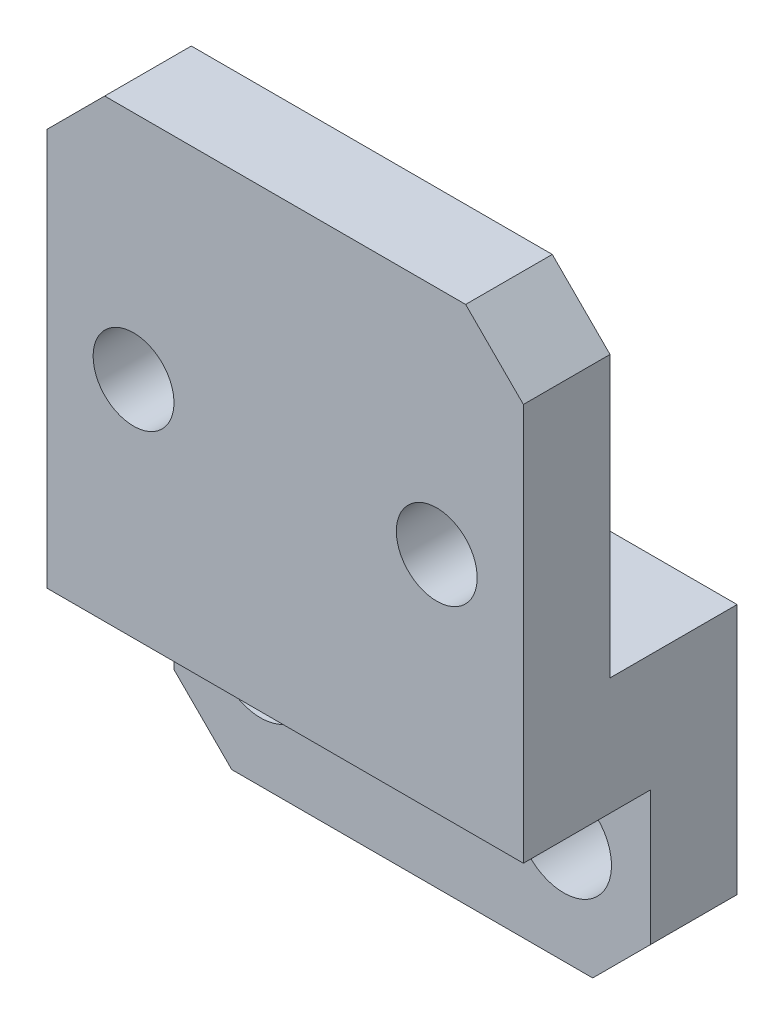
ISO-10303-21;
HEADER;
FILE_DESCRIPTION(('STEP AP214'),'2;1');
FILE_NAME('part.step','',(''),(''),'','','');
FILE_SCHEMA(('AUTOMOTIVE_DESIGN { 1 0 10303 214 1 1 1 1 }'));
ENDSEC;
DATA;
#1=APPLICATION_CONTEXT('core data for automotive mechanical design processes');
#2=APPLICATION_PROTOCOL_DEFINITION('international standard','automotive_design',2000,#1);
#3=PRODUCT_CONTEXT('',#1,'mechanical');
#4=PRODUCT('Part','Part','',(#3));
#5=PRODUCT_RELATED_PRODUCT_CATEGORY('part','',(#4));
#6=PRODUCT_DEFINITION_FORMATION('','',#4);
#7=PRODUCT_DEFINITION_CONTEXT('part definition',#1,'design');
#8=PRODUCT_DEFINITION('design','',#6,#7);
#9=PRODUCT_DEFINITION_SHAPE('','',#8);
#10=(LENGTH_UNIT() NAMED_UNIT(*) SI_UNIT(.MILLI.,.METRE.));
#11=(NAMED_UNIT(*) PLANE_ANGLE_UNIT() SI_UNIT($,.RADIAN.));
#12=(NAMED_UNIT(*) SI_UNIT($,.STERADIAN.) SOLID_ANGLE_UNIT());
#13=UNCERTAINTY_MEASURE_WITH_UNIT(LENGTH_MEASURE(1.E-05),#10,'distance_accuracy_value','');
#14=(GEOMETRIC_REPRESENTATION_CONTEXT(3) GLOBAL_UNCERTAINTY_ASSIGNED_CONTEXT((#13)) GLOBAL_UNIT_ASSIGNED_CONTEXT((#10,
#11,#12)) REPRESENTATION_CONTEXT('',''));
#15=CARTESIAN_POINT('',(0.,0.,0.));
#16=DIRECTION('',(0.,0.,1.));
#17=DIRECTION('',(1.,0.,0.));
#18=AXIS2_PLACEMENT_3D('',#15,#16,#17);
#19=CARTESIAN_POINT('',(0.,0.,-4.40000000000001));
#20=DIRECTION('',(0.,0.,-1.));
#21=DIRECTION('',(-1.,0.,0.));
#22=AXIS2_PLACEMENT_3D('',#19,#20,#21);
#23=PLANE('',#22);
#24=DIRECTION('',(0.,1.,0.));
#25=VECTOR('',#24,1.);
#26=CARTESIAN_POINT('',(-1.72988438920063,-17.1999999999999,-4.40000000000001));
#27=LINE('',#26,#25);
#28=CARTESIAN_POINT('',(-1.72988438920063,-10.900000000024,-4.40000000000001));
#29=VERTEX_POINT('',#28);
#30=CARTESIAN_POINT('',(-1.72988438920063,-0.199999999999945,-4.40000000000001));
#31=VERTEX_POINT('',#30);
#32=EDGE_CURVE('E151',#29,#31,#27,.T.);
#33=ORIENTED_EDGE('',*,*,#32,.F.);
#34=DIRECTION('',(-1.,0.,0.));
#35=VECTOR('',#34,1.);
#36=CARTESIAN_POINT('',(8.24999999999998,-10.900000000024,-4.40000000000001));
#37=LINE('',#36,#35);
#38=CARTESIAN_POINT('',(-6.25000000000001,-10.900000000024,-4.40000000000001));
#39=VERTEX_POINT('',#38);
#40=EDGE_CURVE('E75',#29,#39,#37,.T.);
#41=ORIENTED_EDGE('',*,*,#40,.T.);
#42=DIRECTION('',(0.707106781186549,-0.707106781186546,0.));
#43=VECTOR('',#42,1.);
#44=CARTESIAN_POINT('',(-8.57500000001198,-8.57500000001201,-4.40000000000001));
#45=LINE('',#44,#43);
#46=CARTESIAN_POINT('',(-8.25000000000002,-8.90000000002397,-4.40000000000001));
#47=VERTEX_POINT('',#46);
#48=EDGE_CURVE('E61',#39,#47,#45,.F.);
#49=ORIENTED_EDGE('',*,*,#48,.T.);
#50=DIRECTION('',(0.,1.,0.));
#51=VECTOR('',#50,1.);
#52=CARTESIAN_POINT('',(-8.25000000000002,-0.199999999999944,-4.40000000000001));
#53=LINE('',#52,#51);
#54=CARTESIAN_POINT('',(-8.25000000000002,-0.199999999999944,-4.40000000000001));
#55=VERTEX_POINT('',#54);
#56=EDGE_CURVE('E171',#47,#55,#53,.T.);
#57=ORIENTED_EDGE('',*,*,#56,.T.);
#58=DIRECTION('',(1.,0.,0.));
#59=VECTOR('',#58,1.);
#60=CARTESIAN_POINT('',(8.24999999999998,-0.199999999999944,-4.40000000000001));
#61=LINE('',#60,#59);
#62=EDGE_CURVE('E164',#55,#31,#61,.T.);
#63=ORIENTED_EDGE('',*,*,#62,.T.);
#64=EDGE_LOOP('',(#33,#41,#49,#57,#63));
#65=FACE_BOUND('',#64,.T.);
#66=CARTESIAN_POINT('',(-5.25000000000002,-7.20000000002397,-4.40000000000001));
#67=DIRECTION('',(0.,0.,-1.));
#68=DIRECTION('',(-1.,0.,0.));
#69=AXIS2_PLACEMENT_3D('',#66,#67,#68);
#70=CIRCLE('',#69,1.65);
#71=CARTESIAN_POINT('',(-6.90000000000002,-7.20000000002397,-4.40000000000001));
#72=VERTEX_POINT('',#71);
#73=EDGE_CURVE('E377',#72,#72,#70,.T.);
#74=ORIENTED_EDGE('',*,*,#73,.F.);
#75=EDGE_LOOP('',(#74));
#76=FACE_BOUND('',#75,.T.);
#77=ADVANCED_FACE('F51',(#65,#76),#23,.T.);
#78=CARTESIAN_POINT('',(8.24999999999998,11.5000000000001,3.));
#79=DIRECTION('',(-1.,0.,0.));
#80=DIRECTION('',(0.,0.,1.));
#81=AXIS2_PLACEMENT_3D('',#78,#79,#80);
#82=PLANE('',#81);
#83=DIRECTION('',(0.,1.,0.));
#84=VECTOR('',#83,1.);
#85=CARTESIAN_POINT('',(8.24999999999998,11.5000000000001,0.));
#86=LINE('',#85,#84);
#87=CARTESIAN_POINT('',(8.24999999999998,-0.199999999999944,0.));
#88=VERTEX_POINT('',#87);
#89=CARTESIAN_POINT('',(8.24999999999998,9.50000000000005,0.));
#90=VERTEX_POINT('',#89);
#91=EDGE_CURVE('E203',#88,#90,#86,.T.);
#92=ORIENTED_EDGE('',*,*,#91,.T.);
#93=DIRECTION('',(0.,0.,1.));
#94=VECTOR('',#93,1.);
#95=CARTESIAN_POINT('',(8.24999999999998,9.50000000000005,3.));
#96=LINE('',#95,#94);
#97=CARTESIAN_POINT('',(8.24999999999998,9.50000000000005,3.));
#98=VERTEX_POINT('',#97);
#99=EDGE_CURVE('E272',#90,#98,#96,.T.);
#100=ORIENTED_EDGE('',*,*,#99,.T.);
#101=DIRECTION('',(0.,1.,0.));
#102=VECTOR('',#101,1.);
#103=CARTESIAN_POINT('',(8.24999999999998,11.5000000000001,3.));
#104=LINE('',#103,#102);
#105=CARTESIAN_POINT('',(8.24999999999998,-4.25858882568875,3.));
#106=VERTEX_POINT('',#105);
#107=EDGE_CURVE('E211',#106,#98,#104,.T.);
#108=ORIENTED_EDGE('',*,*,#107,.F.);
#109=DIRECTION('',(0.,0.,-1.));
#110=VECTOR('',#109,1.);
#111=CARTESIAN_POINT('',(8.24999999999998,-4.25858882568875,3.));
#112=LINE('',#111,#110);
#113=CARTESIAN_POINT('',(8.24999999999998,-4.25858882568875,-1.40000000000001));
#114=VERTEX_POINT('',#113);
#115=EDGE_CURVE('E226',#106,#114,#112,.T.);
#116=ORIENTED_EDGE('',*,*,#115,.T.);
#117=DIRECTION('',(0.,-1.,0.));
#118=VECTOR('',#117,1.);
#119=CARTESIAN_POINT('',(8.24999999999998,-0.199999999999944,-1.40000000000001));
#120=LINE('',#119,#118);
#121=CARTESIAN_POINT('',(8.24999999999998,-8.90000000002397,-1.40000000000001));
#122=VERTEX_POINT('',#121);
#123=EDGE_CURVE('E187',#114,#122,#120,.T.);
#124=ORIENTED_EDGE('',*,*,#123,.T.);
#125=DIRECTION('',(0.,0.,-1.));
#126=VECTOR('',#125,1.);
#127=CARTESIAN_POINT('',(8.24999999999998,-8.90000000002397,3.));
#128=LINE('',#127,#126);
#129=CARTESIAN_POINT('',(8.24999999999998,-8.90000000002397,-4.40000000000001));
#130=VERTEX_POINT('',#129);
#131=EDGE_CURVE('E269',#122,#130,#128,.T.);
#132=ORIENTED_EDGE('',*,*,#131,.T.);
#133=DIRECTION('',(0.,-1.,0.));
#134=VECTOR('',#133,1.);
#135=CARTESIAN_POINT('',(8.24999999999998,-0.199999999999944,-4.40000000000001));
#136=LINE('',#135,#134);
#137=CARTESIAN_POINT('',(8.24999999999998,-0.199999999999944,-4.40000000000001));
#138=VERTEX_POINT('',#137);
#139=EDGE_CURVE('E199',#138,#130,#136,.T.);
#140=ORIENTED_EDGE('',*,*,#139,.F.);
#141=DIRECTION('',(0.,0.,1.));
#142=VECTOR('',#141,1.);
#143=CARTESIAN_POINT('',(8.24999999999998,-0.199999999999944,-18.391825777591));
#144=LINE('',#143,#142);
#145=EDGE_CURVE('E181',#138,#88,#144,.T.);
#146=ORIENTED_EDGE('',*,*,#145,.T.);
#147=EDGE_LOOP('',(#92,#100,#108,#116,#124,#132,#140,#146));
#148=FACE_BOUND('',#147,.T.);
#149=ADVANCED_FACE('F317',(#148),#82,.F.);
#150=CARTESIAN_POINT('',(8.24999999999998,11.5000000000001,3.));
#151=DIRECTION('',(0.,-1.,0.));
#152=DIRECTION('',(0.,0.,-1.));
#153=AXIS2_PLACEMENT_3D('',#150,#151,#152);
#154=PLANE('',#153);
#155=DIRECTION('',(-1.,0.,0.));
#156=VECTOR('',#155,1.);
#157=CARTESIAN_POINT('',(8.24999999999998,11.5000000000001,0.));
#158=LINE('',#157,#156);
#159=CARTESIAN_POINT('',(6.24999999999998,11.5000000000001,0.));
#160=VERTEX_POINT('',#159);
#161=CARTESIAN_POINT('',(-6.25000000000001,11.5000000000001,0.));
#162=VERTEX_POINT('',#161);
#163=EDGE_CURVE('E230',#160,#162,#158,.T.);
#164=ORIENTED_EDGE('',*,*,#163,.T.);
#165=DIRECTION('',(0.,0.,1.));
#166=VECTOR('',#165,1.);
#167=CARTESIAN_POINT('',(-6.25000000000001,11.5000000000001,3.));
#168=LINE('',#167,#166);
#169=CARTESIAN_POINT('',(-6.25000000000001,11.5000000000001,3.));
#170=VERTEX_POINT('',#169);
#171=EDGE_CURVE('E260',#162,#170,#168,.T.);
#172=ORIENTED_EDGE('',*,*,#171,.T.);
#173=DIRECTION('',(-1.,0.,0.));
#174=VECTOR('',#173,1.);
#175=CARTESIAN_POINT('',(8.24999999999998,11.5000000000001,3.));
#176=LINE('',#175,#174);
#177=CARTESIAN_POINT('',(6.24999999999998,11.5000000000001,3.));
#178=VERTEX_POINT('',#177);
#179=EDGE_CURVE('E215',#178,#170,#176,.T.);
#180=ORIENTED_EDGE('',*,*,#179,.F.);
#181=DIRECTION('',(0.,0.,-1.));
#182=VECTOR('',#181,1.);
#183=CARTESIAN_POINT('',(6.24999999999998,11.5000000000001,3.));
#184=LINE('',#183,#182);
#185=EDGE_CURVE('E256',#178,#160,#184,.T.);
#186=ORIENTED_EDGE('',*,*,#185,.T.);
#187=EDGE_LOOP('',(#164,#172,#180,#186));
#188=FACE_BOUND('',#187,.T.);
#189=ADVANCED_FACE('F338',(#188),#154,.F.);
#190=CARTESIAN_POINT('',(-8.25000000000002,11.5000000000001,3.));
#191=DIRECTION('',(1.,0.,0.));
#192=DIRECTION('',(0.,0.,-1.));
#193=AXIS2_PLACEMENT_3D('',#190,#191,#192);
#194=PLANE('',#193);
#195=DIRECTION('',(0.,-1.,0.));
#196=VECTOR('',#195,1.);
#197=CARTESIAN_POINT('',(-8.25000000000002,11.5000000000001,3.));
#198=LINE('',#197,#196);
#199=CARTESIAN_POINT('',(-8.25000000000002,9.50000000000006,3.));
#200=VERTEX_POINT('',#199);
#201=CARTESIAN_POINT('',(-8.25000000000002,-4.25858882568875,3.));
#202=VERTEX_POINT('',#201);
#203=EDGE_CURVE('E220',#200,#202,#198,.T.);
#204=ORIENTED_EDGE('',*,*,#203,.F.);
#205=DIRECTION('',(0.,0.,-1.));
#206=VECTOR('',#205,1.);
#207=CARTESIAN_POINT('',(-8.25000000000002,9.50000000000006,3.));
#208=LINE('',#207,#206);
#209=CARTESIAN_POINT('',(-8.25000000000002,9.50000000000006,0.));
#210=VERTEX_POINT('',#209);
#211=EDGE_CURVE('E246',#200,#210,#208,.T.);
#212=ORIENTED_EDGE('',*,*,#211,.T.);
#213=DIRECTION('',(0.,-1.,0.));
#214=VECTOR('',#213,1.);
#215=CARTESIAN_POINT('',(-8.25000000000002,11.5000000000001,0.));
#216=LINE('',#215,#214);
#217=CARTESIAN_POINT('',(-8.25000000000002,-0.199999999999945,0.));
#218=VERTEX_POINT('',#217);
#219=EDGE_CURVE('E216',#210,#218,#216,.T.);
#220=ORIENTED_EDGE('',*,*,#219,.T.);
#221=DIRECTION('',(0.,0.,1.));
#222=VECTOR('',#221,1.);
#223=CARTESIAN_POINT('',(-8.25000000000002,-0.199999999999945,-18.391825777591));
#224=LINE('',#223,#222);
#225=EDGE_CURVE('E204',#55,#218,#224,.T.);
#226=ORIENTED_EDGE('',*,*,#225,.F.);
#227=ORIENTED_EDGE('',*,*,#56,.F.);
#228=DIRECTION('',(0.,0.,1.));
#229=VECTOR('',#228,1.);
#230=CARTESIAN_POINT('',(-8.25000000000002,-8.90000000002397,3.));
#231=LINE('',#230,#229);
#232=CARTESIAN_POINT('',(-8.25000000000002,-8.90000000002397,-1.40000000000001));
#233=VERTEX_POINT('',#232);
#234=EDGE_CURVE('E242',#47,#233,#231,.T.);
#235=ORIENTED_EDGE('',*,*,#234,.T.);
#236=DIRECTION('',(0.,1.,0.));
#237=VECTOR('',#236,1.);
#238=CARTESIAN_POINT('',(-8.25000000000002,-0.199999999999944,-1.40000000000001));
#239=LINE('',#238,#237);
#240=CARTESIAN_POINT('',(-8.25000000000002,-4.25858882568875,-1.40000000000001));
#241=VERTEX_POINT('',#240);
#242=EDGE_CURVE('E196',#233,#241,#239,.T.);
#243=ORIENTED_EDGE('',*,*,#242,.T.);
#244=DIRECTION('',(0.,0.,-1.));
#245=VECTOR('',#244,1.);
#246=CARTESIAN_POINT('',(-8.25000000000002,-4.25858882568875,3.));
#247=LINE('',#246,#245);
#248=EDGE_CURVE('E238',#202,#241,#247,.T.);
#249=ORIENTED_EDGE('',*,*,#248,.F.);
#250=EDGE_LOOP('',(#204,#212,#220,#226,#227,#235,#243,#249));
#251=FACE_BOUND('',#250,.T.);
#252=ADVANCED_FACE('F298',(#251),#194,.F.);
#253=CARTESIAN_POINT('',(8.24999999999998,-4.25858882568875,3.));
#254=DIRECTION('',(0.,1.,0.));
#255=DIRECTION('',(-1.,0.,0.));
#256=AXIS2_PLACEMENT_3D('',#253,#254,#255);
#257=PLANE('',#256);
#258=ORIENTED_EDGE('',*,*,#248,.T.);
#259=DIRECTION('',(1.,0.,0.));
#260=VECTOR('',#259,1.);
#261=CARTESIAN_POINT('',(8.24999999999998,-4.25858882568875,-1.40000000000001));
#262=LINE('',#261,#260);
#263=EDGE_CURVE('E200',#241,#114,#262,.T.);
#264=ORIENTED_EDGE('',*,*,#263,.T.);
#265=ORIENTED_EDGE('',*,*,#115,.F.);
#266=DIRECTION('',(1.,0.,0.));
#267=VECTOR('',#266,1.);
#268=CARTESIAN_POINT('',(8.24999999999998,-4.25858882568875,3.));
#269=LINE('',#268,#267);
#270=EDGE_CURVE('E223',#202,#106,#269,.T.);
#271=ORIENTED_EDGE('',*,*,#270,.F.);
#272=EDGE_LOOP('',(#258,#264,#265,#271));
#273=FACE_BOUND('',#272,.T.);
#274=ADVANCED_FACE('F324',(#273),#257,.F.);
#275=CARTESIAN_POINT('',(0.,0.,3.));
#276=DIRECTION('',(0.,0.,-1.));
#277=DIRECTION('',(-1.,0.,0.));
#278=AXIS2_PLACEMENT_3D('',#275,#276,#277);
#279=PLANE('',#278);
#280=CARTESIAN_POINT('',(5.24999999999997,3.50000000000006,3.));
#281=DIRECTION('',(0.,0.,-1.));
#282=DIRECTION('',(-1.,0.,0.));
#283=AXIS2_PLACEMENT_3D('',#280,#281,#282);
#284=CIRCLE('',#283,1.4);
#285=CARTESIAN_POINT('',(3.84999999999997,3.50000000000006,3.));
#286=VERTEX_POINT('',#285);
#287=EDGE_CURVE('E363',#286,#286,#284,.T.);
#288=ORIENTED_EDGE('',*,*,#287,.T.);
#289=EDGE_LOOP('',(#288));
#290=FACE_BOUND('',#289,.T.);
#291=CARTESIAN_POINT('',(-5.25000000000003,3.50000000000006,3.));
#292=DIRECTION('',(0.,0.,-1.));
#293=DIRECTION('',(-1.,0.,0.));
#294=AXIS2_PLACEMENT_3D('',#291,#292,#293);
#295=CIRCLE('',#294,1.4);
#296=CARTESIAN_POINT('',(-6.65000000000003,3.50000000000006,3.));
#297=VERTEX_POINT('',#296);
#298=EDGE_CURVE('E157',#297,#297,#295,.T.);
#299=ORIENTED_EDGE('',*,*,#298,.T.);
#300=EDGE_LOOP('',(#299));
#301=FACE_BOUND('',#300,.T.);
#302=ORIENTED_EDGE('',*,*,#179,.T.);
#303=DIRECTION('',(0.707106781186549,0.707106781186546,0.));
#304=VECTOR('',#303,1.);
#305=CARTESIAN_POINT('',(-8.25000000000002,9.50000000000006,3.));
#306=LINE('',#305,#304);
#307=EDGE_CURVE('E266',#170,#200,#306,.F.);
#308=ORIENTED_EDGE('',*,*,#307,.T.);
#309=ORIENTED_EDGE('',*,*,#203,.T.);
#310=ORIENTED_EDGE('',*,*,#270,.T.);
#311=ORIENTED_EDGE('',*,*,#107,.T.);
#312=DIRECTION('',(0.707106781186546,-0.707106781186549,0.));
#313=VECTOR('',#312,1.);
#314=CARTESIAN_POINT('',(6.24999999999998,11.5000000000001,3.));
#315=LINE('',#314,#313);
#316=EDGE_CURVE('E263',#98,#178,#315,.F.);
#317=ORIENTED_EDGE('',*,*,#316,.T.);
#318=EDGE_LOOP('',(#302,#308,#309,#310,#311,#317));
#319=FACE_BOUND('',#318,.T.);
#320=ADVANCED_FACE('F417',(#290,#301,#319),#279,.F.);
#321=CARTESIAN_POINT('',(0.,0.,0.));
#322=DIRECTION('',(0.,0.,-1.));
#323=DIRECTION('',(-1.,0.,0.));
#324=AXIS2_PLACEMENT_3D('',#321,#322,#323);
#325=PLANE('',#324);
#326=CARTESIAN_POINT('',(5.24999999999997,3.50000000000006,0.));
#327=DIRECTION('',(0.,0.,-1.));
#328=DIRECTION('',(-1.,0.,0.));
#329=AXIS2_PLACEMENT_3D('',#326,#327,#328);
#330=CIRCLE('',#329,1.4);
#331=CARTESIAN_POINT('',(3.84999999999997,3.50000000000006,0.));
#332=VERTEX_POINT('',#331);
#333=EDGE_CURVE('E368',#332,#332,#330,.T.);
#334=ORIENTED_EDGE('',*,*,#333,.F.);
#335=EDGE_LOOP('',(#334));
#336=FACE_BOUND('',#335,.T.);
#337=CARTESIAN_POINT('',(-5.25000000000003,3.50000000000006,0.));
#338=DIRECTION('',(0.,0.,-1.));
#339=DIRECTION('',(-1.,0.,0.));
#340=AXIS2_PLACEMENT_3D('',#337,#338,#339);
#341=CIRCLE('',#340,1.4);
#342=CARTESIAN_POINT('',(-6.65000000000003,3.50000000000006,0.));
#343=VERTEX_POINT('',#342);
#344=EDGE_CURVE('E372',#343,#343,#341,.T.);
#345=ORIENTED_EDGE('',*,*,#344,.F.);
#346=EDGE_LOOP('',(#345));
#347=FACE_BOUND('',#346,.T.);
#348=ORIENTED_EDGE('',*,*,#219,.F.);
#349=DIRECTION('',(-0.707106781186549,-0.707106781186546,0.));
#350=VECTOR('',#349,1.);
#351=CARTESIAN_POINT('',(-8.87500000000002,8.87500000000006,0.));
#352=LINE('',#351,#350);
#353=EDGE_CURVE('E253',#210,#162,#352,.F.);
#354=ORIENTED_EDGE('',*,*,#353,.T.);
#355=ORIENTED_EDGE('',*,*,#163,.F.);
#356=DIRECTION('',(-0.707106781186546,0.707106781186549,0.));
#357=VECTOR('',#356,1.);
#358=CARTESIAN_POINT('',(8.87500000000003,8.875,0.));
#359=LINE('',#358,#357);
#360=EDGE_CURVE('E250',#160,#90,#359,.F.);
#361=ORIENTED_EDGE('',*,*,#360,.T.);
#362=ORIENTED_EDGE('',*,*,#91,.F.);
#363=DIRECTION('',(1.,0.,0.));
#364=VECTOR('',#363,1.);
#365=CARTESIAN_POINT('',(8.24999999999998,-0.199999999999944,0.));
#366=LINE('',#365,#364);
#367=EDGE_CURVE('E174',#218,#88,#366,.T.);
#368=ORIENTED_EDGE('',*,*,#367,.F.);
#369=EDGE_LOOP('',(#348,#354,#355,#361,#362,#368));
#370=FACE_BOUND('',#369,.T.);
#371=ADVANCED_FACE('F335',(#336,#347,#370),#325,.T.);
#372=CARTESIAN_POINT('',(8.24999999999998,-0.199999999999944,-18.391825777591));
#373=DIRECTION('',(0.,-1.,0.));
#374=DIRECTION('',(1.,0.,0.));
#375=AXIS2_PLACEMENT_3D('',#372,#373,#374);
#376=PLANE('',#375);
#377=CARTESIAN_POINT('',(1.72988438920059,-0.199999999999944,-4.40000000000001));
#378=VERTEX_POINT('',#377);
#379=EDGE_CURVE('E166',#378,#138,#61,.T.);
#380=ORIENTED_EDGE('',*,*,#379,.F.);
#381=CARTESIAN_POINT('',(0.,-0.199999999999945,-8.50000000000001));
#382=DIRECTION('',(0.,1.,0.));
#383=DIRECTION('',(-1.,0.,0.));
#384=AXIS2_PLACEMENT_3D('',#381,#382,#383);
#385=CIRCLE('',#384,4.45);
#386=EDGE_CURVE('E154',#31,#378,#385,.T.);
#387=ORIENTED_EDGE('',*,*,#386,.F.);
#388=ORIENTED_EDGE('',*,*,#62,.F.);
#389=ORIENTED_EDGE('',*,*,#225,.T.);
#390=ORIENTED_EDGE('',*,*,#367,.T.);
#391=ORIENTED_EDGE('',*,*,#145,.F.);
#392=EDGE_LOOP('',(#380,#387,#388,#389,#390,#391));
#393=FACE_BOUND('',#392,.T.);
#394=ADVANCED_FACE('F162',(#393),#376,.F.);
#395=DIRECTION('',(0.,1.,0.));
#396=VECTOR('',#395,1.);
#397=CARTESIAN_POINT('',(1.72988438920059,-17.1999999999999,-4.40000000000001));
#398=LINE('',#397,#396);
#399=CARTESIAN_POINT('',(1.72988438920059,-10.900000000024,-4.40000000000001));
#400=VERTEX_POINT('',#399);
#401=EDGE_CURVE('E68',#378,#400,#398,.F.);
#402=ORIENTED_EDGE('',*,*,#401,.F.);
#403=ORIENTED_EDGE('',*,*,#379,.T.);
#404=ORIENTED_EDGE('',*,*,#139,.T.);
#405=DIRECTION('',(0.707106781186547,0.707106781186549,0.));
#406=VECTOR('',#405,1.);
#407=CARTESIAN_POINT('',(8.57500000001198,-8.57500000001196,-4.40000000000001));
#408=LINE('',#407,#406);
#409=CARTESIAN_POINT('',(6.24999999999998,-10.900000000024,-4.40000000000001));
#410=VERTEX_POINT('',#409);
#411=EDGE_CURVE('E288',#130,#410,#408,.F.);
#412=ORIENTED_EDGE('',*,*,#411,.T.);
#413=EDGE_CURVE('E301',#410,#400,#37,.T.);
#414=ORIENTED_EDGE('',*,*,#413,.T.);
#415=EDGE_LOOP('',(#402,#403,#404,#412,#414));
#416=FACE_BOUND('',#415,.T.);
#417=CARTESIAN_POINT('',(5.24999999999998,-7.20000000002397,-4.40000000000001));
#418=DIRECTION('',(0.,0.,-1.));
#419=DIRECTION('',(-1.,0.,0.));
#420=AXIS2_PLACEMENT_3D('',#417,#418,#419);
#421=CIRCLE('',#420,1.65);
#422=CARTESIAN_POINT('',(3.59999999999998,-7.20000000002397,-4.40000000000001));
#423=VERTEX_POINT('',#422);
#424=EDGE_CURVE('E192',#423,#423,#421,.T.);
#425=ORIENTED_EDGE('',*,*,#424,.F.);
#426=EDGE_LOOP('',(#425));
#427=FACE_BOUND('',#426,.T.);
#428=ADVANCED_FACE('F357',(#416,#427),#23,.T.);
#429=CARTESIAN_POINT('',(0.,0.,-1.40000000000001));
#430=DIRECTION('',(0.,0.,-1.));
#431=DIRECTION('',(-1.,0.,0.));
#432=AXIS2_PLACEMENT_3D('',#429,#430,#431);
#433=PLANE('',#432);
#434=ORIENTED_EDGE('',*,*,#242,.F.);
#435=DIRECTION('',(-0.707106781186549,0.707106781186546,0.));
#436=VECTOR('',#435,1.);
#437=CARTESIAN_POINT('',(-8.25000000000002,-8.90000000002397,-1.40000000000001));
#438=LINE('',#437,#436);
#439=CARTESIAN_POINT('',(-6.25000000000001,-10.900000000024,-1.40000000000001));
#440=VERTEX_POINT('',#439);
#441=EDGE_CURVE('E278',#233,#440,#438,.F.);
#442=ORIENTED_EDGE('',*,*,#441,.T.);
#443=DIRECTION('',(-1.,0.,0.));
#444=VECTOR('',#443,1.);
#445=CARTESIAN_POINT('',(8.24999999999998,-10.900000000024,-1.40000000000001));
#446=LINE('',#445,#444);
#447=CARTESIAN_POINT('',(6.24999999999998,-10.900000000024,-1.40000000000001));
#448=VERTEX_POINT('',#447);
#449=EDGE_CURVE('E191',#448,#440,#446,.T.);
#450=ORIENTED_EDGE('',*,*,#449,.F.);
#451=DIRECTION('',(-0.707106781186547,-0.707106781186549,0.));
#452=VECTOR('',#451,1.);
#453=CARTESIAN_POINT('',(6.24999999999998,-10.900000000024,-1.40000000000001));
#454=LINE('',#453,#452);
#455=EDGE_CURVE('E275',#448,#122,#454,.F.);
#456=ORIENTED_EDGE('',*,*,#455,.T.);
#457=ORIENTED_EDGE('',*,*,#123,.F.);
#458=ORIENTED_EDGE('',*,*,#263,.F.);
#459=EDGE_LOOP('',(#434,#442,#450,#456,#457,#458));
#460=FACE_BOUND('',#459,.T.);
#461=CARTESIAN_POINT('',(5.24999999999998,-7.20000000002397,-1.40000000000001));
#462=DIRECTION('',(0.,0.,-1.));
#463=DIRECTION('',(-1.,0.,0.));
#464=AXIS2_PLACEMENT_3D('',#461,#462,#463);
#465=CIRCLE('',#464,1.65);
#466=CARTESIAN_POINT('',(3.59999999999998,-7.20000000002397,-1.40000000000001));
#467=VERTEX_POINT('',#466);
#468=EDGE_CURVE('E351',#467,#467,#465,.T.);
#469=ORIENTED_EDGE('',*,*,#468,.T.);
#470=EDGE_LOOP('',(#469));
#471=FACE_BOUND('',#470,.T.);
#472=CARTESIAN_POINT('',(-5.25000000000002,-7.20000000002397,-1.40000000000001));
#473=DIRECTION('',(0.,0.,-1.));
#474=DIRECTION('',(-1.,0.,0.));
#475=AXIS2_PLACEMENT_3D('',#472,#473,#474);
#476=CIRCLE('',#475,1.65);
#477=CARTESIAN_POINT('',(-6.90000000000002,-7.20000000002397,-1.40000000000001));
#478=VERTEX_POINT('',#477);
#479=EDGE_CURVE('E367',#478,#478,#476,.T.);
#480=ORIENTED_EDGE('',*,*,#479,.T.);
#481=EDGE_LOOP('',(#480));
#482=FACE_BOUND('',#481,.T.);
#483=ADVANCED_FACE('F305',(#460,#471,#482),#433,.F.);
#484=CARTESIAN_POINT('',(8.24999999999998,-10.900000000024,-4.40000000000001));
#485=DIRECTION('',(0.,1.,0.));
#486=DIRECTION('',(0.,0.,1.));
#487=AXIS2_PLACEMENT_3D('',#484,#485,#486);
#488=PLANE('',#487);
#489=ORIENTED_EDGE('',*,*,#40,.F.);
#490=CARTESIAN_POINT('',(0.,-10.900000000024,-8.50000000000001));
#491=DIRECTION('',(0.,1.,0.));
#492=DIRECTION('',(0.,0.,1.));
#493=AXIS2_PLACEMENT_3D('',#490,#491,#492);
#494=CIRCLE('',#493,4.45);
#495=EDGE_CURVE('E11',#29,#400,#494,.T.);
#496=ORIENTED_EDGE('',*,*,#495,.T.);
#497=ORIENTED_EDGE('',*,*,#413,.F.);
#498=DIRECTION('',(0.,0.,1.));
#499=VECTOR('',#498,1.);
#500=CARTESIAN_POINT('',(6.24999999999998,-10.900000000024,-4.40000000000001));
#501=LINE('',#500,#499);
#502=EDGE_CURVE('E281',#410,#448,#501,.T.);
#503=ORIENTED_EDGE('',*,*,#502,.T.);
#504=ORIENTED_EDGE('',*,*,#449,.T.);
#505=DIRECTION('',(0.,0.,-1.));
#506=VECTOR('',#505,1.);
#507=CARTESIAN_POINT('',(-6.25000000000001,-10.900000000024,-4.40000000000001));
#508=LINE('',#507,#506);
#509=EDGE_CURVE('E285',#440,#39,#508,.T.);
#510=ORIENTED_EDGE('',*,*,#509,.T.);
#511=EDGE_LOOP('',(#489,#496,#497,#503,#504,#510));
#512=FACE_BOUND('',#511,.T.);
#513=ADVANCED_FACE('F309',(#512),#488,.F.);
#514=CARTESIAN_POINT('',(5.24999999999998,-7.20000000002397,-4.40000000000001));
#515=DIRECTION('',(0.,0.,1.));
#516=DIRECTION('',(1.,0.,0.));
#517=AXIS2_PLACEMENT_3D('',#514,#515,#516);
#518=CYLINDRICAL_SURFACE('',#517,1.65);
#519=ORIENTED_EDGE('',*,*,#424,.T.);
#520=EDGE_LOOP('',(#519));
#521=FACE_BOUND('',#520,.T.);
#522=ORIENTED_EDGE('',*,*,#468,.F.);
#523=EDGE_LOOP('',(#522));
#524=FACE_BOUND('',#523,.T.);
#525=ADVANCED_FACE('F393',(#521,#524),#518,.F.);
#526=CARTESIAN_POINT('',(-5.25000000000002,-7.20000000002397,-4.40000000000001));
#527=DIRECTION('',(0.,0.,1.));
#528=DIRECTION('',(1.,0.,0.));
#529=AXIS2_PLACEMENT_3D('',#526,#527,#528);
#530=CYLINDRICAL_SURFACE('',#529,1.65);
#531=ORIENTED_EDGE('',*,*,#73,.T.);
#532=EDGE_LOOP('',(#531));
#533=FACE_BOUND('',#532,.T.);
#534=ORIENTED_EDGE('',*,*,#479,.F.);
#535=EDGE_LOOP('',(#534));
#536=FACE_BOUND('',#535,.T.);
#537=ADVANCED_FACE('F395',(#533,#536),#530,.F.);
#538=CARTESIAN_POINT('',(-5.25000000000003,3.50000000000006,3.));
#539=DIRECTION('',(0.,0.,-1.));
#540=DIRECTION('',(-1.,0.,0.));
#541=AXIS2_PLACEMENT_3D('',#538,#539,#540);
#542=CYLINDRICAL_SURFACE('',#541,1.4);
#543=ORIENTED_EDGE('',*,*,#298,.F.);
#544=EDGE_LOOP('',(#543));
#545=FACE_BOUND('',#544,.T.);
#546=ORIENTED_EDGE('',*,*,#344,.T.);
#547=EDGE_LOOP('',(#546));
#548=FACE_BOUND('',#547,.T.);
#549=ADVANCED_FACE('F400',(#545,#548),#542,.F.);
#550=CARTESIAN_POINT('',(5.24999999999997,3.50000000000006,3.));
#551=DIRECTION('',(0.,0.,-1.));
#552=DIRECTION('',(-1.,0.,0.));
#553=AXIS2_PLACEMENT_3D('',#550,#551,#552);
#554=CYLINDRICAL_SURFACE('',#553,1.4);
#555=ORIENTED_EDGE('',*,*,#287,.F.);
#556=EDGE_LOOP('',(#555));
#557=FACE_BOUND('',#556,.T.);
#558=ORIENTED_EDGE('',*,*,#333,.T.);
#559=EDGE_LOOP('',(#558));
#560=FACE_BOUND('',#559,.T.);
#561=ADVANCED_FACE('F436',(#557,#560),#554,.F.);
#562=CARTESIAN_POINT('',(-8.25000000000002,9.50000000000006,3.));
#563=DIRECTION('',(0.707106781186546,-0.707106781186549,0.));
#564=DIRECTION('',(0.,0.,-1.));
#565=AXIS2_PLACEMENT_3D('',#562,#563,#564);
#566=PLANE('',#565);
#567=ORIENTED_EDGE('',*,*,#307,.F.);
#568=ORIENTED_EDGE('',*,*,#171,.F.);
#569=ORIENTED_EDGE('',*,*,#353,.F.);
#570=ORIENTED_EDGE('',*,*,#211,.F.);
#571=EDGE_LOOP('',(#567,#568,#569,#570));
#572=FACE_BOUND('',#571,.T.);
#573=ADVANCED_FACE('F331',(#572),#566,.F.);
#574=CARTESIAN_POINT('',(6.24999999999998,11.5000000000001,3.));
#575=DIRECTION('',(-0.707106781186549,-0.707106781186546,0.));
#576=DIRECTION('',(0.,0.,-1.));
#577=AXIS2_PLACEMENT_3D('',#574,#575,#576);
#578=PLANE('',#577);
#579=ORIENTED_EDGE('',*,*,#316,.F.);
#580=ORIENTED_EDGE('',*,*,#99,.F.);
#581=ORIENTED_EDGE('',*,*,#360,.F.);
#582=ORIENTED_EDGE('',*,*,#185,.F.);
#583=EDGE_LOOP('',(#579,#580,#581,#582));
#584=FACE_BOUND('',#583,.T.);
#585=ADVANCED_FACE('F343',(#584),#578,.F.);
#586=CARTESIAN_POINT('',(-8.25000000000002,-8.90000000002397,3.));
#587=DIRECTION('',(0.707106781186546,0.707106781186549,0.));
#588=DIRECTION('',(0.,0.,1.));
#589=AXIS2_PLACEMENT_3D('',#586,#587,#588);
#590=PLANE('',#589);
#591=ORIENTED_EDGE('',*,*,#48,.F.);
#592=ORIENTED_EDGE('',*,*,#509,.F.);
#593=ORIENTED_EDGE('',*,*,#441,.F.);
#594=ORIENTED_EDGE('',*,*,#234,.F.);
#595=EDGE_LOOP('',(#591,#592,#593,#594));
#596=FACE_BOUND('',#595,.T.);
#597=ADVANCED_FACE('F302',(#596),#590,.F.);
#598=CARTESIAN_POINT('',(6.24999999999998,-10.900000000024,-4.40000000000001));
#599=DIRECTION('',(-0.707106781186549,0.707106781186547,0.));
#600=DIRECTION('',(0.,0.,1.));
#601=AXIS2_PLACEMENT_3D('',#598,#599,#600);
#602=PLANE('',#601);
#603=ORIENTED_EDGE('',*,*,#411,.F.);
#604=ORIENTED_EDGE('',*,*,#131,.F.);
#605=ORIENTED_EDGE('',*,*,#455,.F.);
#606=ORIENTED_EDGE('',*,*,#502,.F.);
#607=EDGE_LOOP('',(#603,#604,#605,#606));
#608=FACE_BOUND('',#607,.T.);
#609=ADVANCED_FACE('F54',(#608),#602,.F.);
#610=CARTESIAN_POINT('',(0.,-17.1999999999999,-8.50000000000001));
#611=DIRECTION('',(0.,1.,0.));
#612=DIRECTION('',(-1.,0.,0.));
#613=AXIS2_PLACEMENT_3D('',#610,#611,#612);
#614=CYLINDRICAL_SURFACE('',#613,4.45);
#615=ORIENTED_EDGE('',*,*,#32,.T.);
#616=ORIENTED_EDGE('',*,*,#386,.T.);
#617=ORIENTED_EDGE('',*,*,#401,.T.);
#618=ORIENTED_EDGE('',*,*,#495,.F.);
#619=EDGE_LOOP('',(#615,#616,#617,#618));
#620=FACE_BOUND('',#619,.T.);
#621=ADVANCED_FACE('F153',(#620),#614,.F.);
#622=CLOSED_SHELL('',(#77,#149,#189,#252,#274,#320,#371,#394,#428,#483,#513,#525,#537,#549,#561,
#573,#585,#597,#609,#621));
#623=MANIFOLD_SOLID_BREP('B2',#622);
#624=ADVANCED_BREP_SHAPE_REPRESENTATION('',(#18,#623),#14);
#625=SHAPE_DEFINITION_REPRESENTATION(#9,#624);
ENDSEC;
END-ISO-10303-21;
